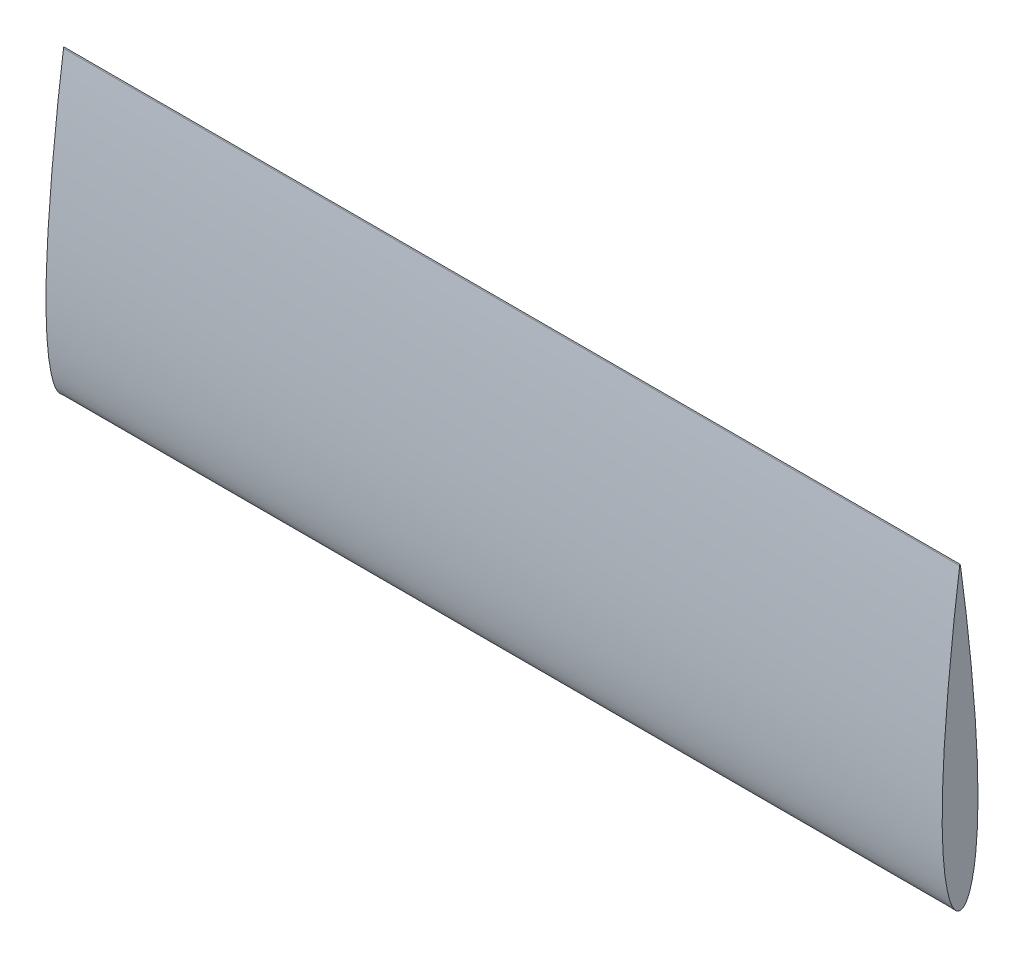
ISO-10303-21;
HEADER;
FILE_DESCRIPTION(('STEP AP214'),'2;1');
FILE_NAME('part.step','',(''),(''),'','','');
FILE_SCHEMA(('AUTOMOTIVE_DESIGN { 1 0 10303 214 1 1 1 1 }'));
ENDSEC;
DATA;
#1=APPLICATION_CONTEXT('core data for automotive mechanical design processes');
#2=APPLICATION_PROTOCOL_DEFINITION('international standard','automotive_design',2000,#1);
#3=PRODUCT_CONTEXT('',#1,'mechanical');
#4=PRODUCT('Part','Part','',(#3));
#5=PRODUCT_RELATED_PRODUCT_CATEGORY('part','',(#4));
#6=PRODUCT_DEFINITION_FORMATION('','',#4);
#7=PRODUCT_DEFINITION_CONTEXT('part definition',#1,'design');
#8=PRODUCT_DEFINITION('design','',#6,#7);
#9=PRODUCT_DEFINITION_SHAPE('','',#8);
#10=(LENGTH_UNIT() NAMED_UNIT(*) SI_UNIT(.MILLI.,.METRE.));
#11=(NAMED_UNIT(*) PLANE_ANGLE_UNIT() SI_UNIT($,.RADIAN.));
#12=(NAMED_UNIT(*) SI_UNIT($,.STERADIAN.) SOLID_ANGLE_UNIT());
#13=UNCERTAINTY_MEASURE_WITH_UNIT(LENGTH_MEASURE(1.E-05),#10,'distance_accuracy_value','');
#14=(GEOMETRIC_REPRESENTATION_CONTEXT(3) GLOBAL_UNCERTAINTY_ASSIGNED_CONTEXT((#13)) GLOBAL_UNIT_ASSIGNED_CONTEXT((#10,
#11,#12)) REPRESENTATION_CONTEXT('',''));
#15=CARTESIAN_POINT('',(0.,0.,0.));
#16=DIRECTION('',(0.,0.,1.));
#17=DIRECTION('',(1.,0.,0.));
#18=AXIS2_PLACEMENT_3D('',#15,#16,#17);
#19=CARTESIAN_POINT('',(300.,199.967881444763,-0.25650578558449));
#20=CARTESIAN_POINT('',(300.,201.774256733193,0.225257482093221));
#21=CARTESIAN_POINT('',(300.,200.,0.252));
#22=B_SPLINE_CURVE_WITH_KNOTS('',2,(#19,#20,#21),.UNSPECIFIED.,.F.,.F.,(3,3),(0.,1.),.UNSPECIFIED.);
#23=DIRECTION('',(-1.,0.,0.));
#24=VECTOR('',#23,1.);
#25=SURFACE_OF_LINEAR_EXTRUSION('',#22,#24);
#26=CARTESIAN_POINT('',(-300.,199.967881444763,-0.25650578558449));
#27=CARTESIAN_POINT('',(-300.,201.774256733193,0.225257482093221));
#28=CARTESIAN_POINT('',(-300.,200.,0.252));
#29=B_SPLINE_CURVE_WITH_KNOTS('',2,(#26,#27,#28),.UNSPECIFIED.,.F.,.F.,(3,3),(0.,1.),.UNSPECIFIED.);
#30=CARTESIAN_POINT('',(-300.,199.967881444761,-0.256505785584748));
#31=VERTEX_POINT('',#30);
#32=CARTESIAN_POINT('',(-300.,200.,0.252));
#33=VERTEX_POINT('',#32);
#34=EDGE_CURVE('E73',#31,#33,#29,.T.);
#35=ORIENTED_EDGE('',*,*,#34,.T.);
#36=DIRECTION('',(-1.,0.,0.));
#37=VECTOR('',#36,1.);
#38=CARTESIAN_POINT('',(300.,200.,0.252));
#39=LINE('',#38,#37);
#40=CARTESIAN_POINT('',(300.,200.,0.252));
#41=VERTEX_POINT('',#40);
#42=EDGE_CURVE('E11',#41,#33,#39,.T.);
#43=ORIENTED_EDGE('',*,*,#42,.F.);
#44=CARTESIAN_POINT('',(300.,199.967881444761,-0.256505785584748));
#45=VERTEX_POINT('',#44);
#46=EDGE_CURVE('E72',#45,#41,#22,.T.);
#47=ORIENTED_EDGE('',*,*,#46,.F.);
#48=DIRECTION('',(-1.,0.,0.));
#49=VECTOR('',#48,1.);
#50=CARTESIAN_POINT('',(300.,199.967881444761,-0.256505785584748));
#51=LINE('',#50,#49);
#52=EDGE_CURVE('E49',#45,#31,#51,.T.);
#53=ORIENTED_EDGE('',*,*,#52,.T.);
#54=EDGE_LOOP('',(#35,#43,#47,#53));
#55=FACE_BOUND('',#54,.T.);
#56=ADVANCED_FACE('F39',(#55),#25,.F.);
#57=CARTESIAN_POINT('',(300.,200.,0.252));
#58=CARTESIAN_POINT('',(300.,199.961073462549,0.257460921680953));
#59=CARTESIAN_POINT('',(300.,199.805464344266,0.279290996057645));
#60=CARTESIAN_POINT('',(300.,199.455684465291,0.328259605959474));
#61=CARTESIAN_POINT('',(300.,198.873630390625,0.409571381439755));
#62=CARTESIAN_POINT('',(300.,198.060656684456,0.522607426542408));
#63=CARTESIAN_POINT('',(300.,197.01866306736,0.666674539094853));
#64=CARTESIAN_POINT('',(300.,195.750085834567,0.840827461802448));
#65=CARTESIAN_POINT('',(300.,194.257880939373,1.04398693476492));
#66=CARTESIAN_POINT('',(300.,192.545535290461,1.27484720368877));
#67=CARTESIAN_POINT('',(300.,190.61704905316,1.53204746540601));
#68=CARTESIAN_POINT('',(300.,188.476922374053,1.81396953992731));
#69=CARTESIAN_POINT('',(300.,186.130159115465,2.11909904573172));
#70=CARTESIAN_POINT('',(300.,183.582224802527,2.44556113638906));
#71=CARTESIAN_POINT('',(300.,180.839083113847,2.79168172565745));
#72=CARTESIAN_POINT('',(300.,177.90713489902,3.15552337625383));
#73=CARTESIAN_POINT('',(300.,174.793235845287,3.53525218983446));
#74=CARTESIAN_POINT('',(300.,171.504645491081,3.92887756349891));
#75=CARTESIAN_POINT('',(300.,168.049053797605,4.33446003560873));
#76=CARTESIAN_POINT('',(300.,164.434531838681,4.75000692044848));
#77=CARTESIAN_POINT('',(300.,160.669528566926,5.1735858108412));
#78=CARTESIAN_POINT('',(300.,156.762822362585,5.60304436219836));
#79=CARTESIAN_POINT('',(300.,152.723540745018,6.03645832345471));
#80=CARTESIAN_POINT('',(300.,148.561125948286,6.47171923483878));
#81=CARTESIAN_POINT('',(300.,144.28528894305,6.90668685811932));
#82=CARTESIAN_POINT('',(300.,139.906034430789,7.33924636280671));
#83=CARTESIAN_POINT('',(300.,135.433569915737,7.76715096920159));
#84=CARTESIAN_POINT('',(300.,130.87835580778,8.18822315989405));
#85=CARTESIAN_POINT('',(300.,126.251019670898,8.60009997450111));
#86=CARTESIAN_POINT('',(300.,121.562382137434,9.00041300473399));
#87=CARTESIAN_POINT('',(300.,116.82337623243,9.38673601910347));
#88=CARTESIAN_POINT('',(300.,112.045077582558,9.75654540491965));
#89=CARTESIAN_POINT('',(300.,107.238642718273,10.1073665851091));
#90=CARTESIAN_POINT('',(300.,102.41529865337,10.4365698856851));
#91=CARTESIAN_POINT('',(300.,97.5863044345595,10.7415705842048));
#92=CARTESIAN_POINT('',(300.,92.7629375322089,11.0197752255089));
#93=CARTESIAN_POINT('',(300.,87.9564610192973,11.2685992236009));
#94=CARTESIAN_POINT('',(300.,83.1780927360442,11.485535840479));
#95=CARTESIAN_POINT('',(300.,78.4389885199032,11.6681228013325));
#96=CARTESIAN_POINT('',(300.,73.7502179623397,11.8140110543217));
#97=CARTESIAN_POINT('',(300.,69.122732446521,11.9210697806734));
#98=CARTESIAN_POINT('',(300.,64.56732733007,11.9872639086109));
#99=CARTESIAN_POINT('',(300.,60.0946393384857,12.0107998429971));
#100=CARTESIAN_POINT('',(300.,55.715111858067,11.9901384631717));
#101=CARTESIAN_POINT('',(300.,51.438973700615,11.924044272335));
#102=CARTESIAN_POINT('',(300.,47.2762014563288,11.8114941108719));
#103=CARTESIAN_POINT('',(300.,43.2365098395361,11.6518729595225));
#104=CARTESIAN_POINT('',(300.,39.3293305367621,11.4448824195998));
#105=CARTESIAN_POINT('',(300.,35.563786306922,11.1904762438273));
#106=CARTESIAN_POINT('',(300.,31.9486493938713,10.8890815711004));
#107=CARTESIAN_POINT('',(300.,28.4923434716612,10.5413955710374));
#108=CARTESIAN_POINT('',(300.,25.2029279406108,10.1483856764614));
#109=CARTESIAN_POINT('',(300.,22.0880474804513,9.71145571984603));
#110=CARTESIAN_POINT('',(300.,19.1549471204692,9.23208075318621));
#111=CARTESIAN_POINT('',(300.,16.4103963388728,8.71222812186602));
#112=CARTESIAN_POINT('',(300.,13.8607397636473,8.15378925483745));
#113=CARTESIAN_POINT('',(300.,11.5117794611663,7.55905821858464));
#114=CARTESIAN_POINT('',(300.,9.36884743424348,6.93019405439805));
#115=CARTESIAN_POINT('',(300.,7.43665990001652,6.26956601469714));
#116=CARTESIAN_POINT('',(300.,5.71934085794232,5.57938733984499));
#117=CARTESIAN_POINT('',(300.,4.22029726535338,4.86171235858859));
#118=CARTESIAN_POINT('',(300.,2.94218695582956,4.1181678871452));
#119=CARTESIAN_POINT('',(300.,1.886880457348,3.34959873201076));
#120=CARTESIAN_POINT('',(300.,1.05591435132427,2.55527055797925));
#121=CARTESIAN_POINT('',(300.,0.451977280813522,1.73239335837833));
#122=CARTESIAN_POINT('',(300.,0.0824005390450488,0.877395637301859));
#123=CARTESIAN_POINT('',(300.,-0.0401679816202648,0.));
#124=CARTESIAN_POINT('',(300.,0.0824005390450501,-0.877395637301861));
#125=CARTESIAN_POINT('',(300.,0.451977280813513,-1.73239335837832));
#126=CARTESIAN_POINT('',(300.,1.05591435132429,-2.55527055797928));
#127=CARTESIAN_POINT('',(300.,1.88688045734799,-3.34959873201075));
#128=CARTESIAN_POINT('',(300.,2.94218695582957,-4.11816788714522));
#129=CARTESIAN_POINT('',(300.,4.22029726535336,-4.86171235858858));
#130=CARTESIAN_POINT('',(300.,5.71934085794231,-5.57938733984499));
#131=CARTESIAN_POINT('',(300.,7.43665990001654,-6.26956601469715));
#132=CARTESIAN_POINT('',(300.,9.36884743424346,-6.93019405439804));
#133=CARTESIAN_POINT('',(300.,11.5117794611663,-7.55905821858464));
#134=CARTESIAN_POINT('',(300.,13.8607397636473,-8.15378925483745));
#135=CARTESIAN_POINT('',(300.,16.4103963388728,-8.71222812186602));
#136=CARTESIAN_POINT('',(300.,19.1549471204692,-9.2320807531862));
#137=CARTESIAN_POINT('',(300.,22.0880474804514,-9.71145571984605));
#138=CARTESIAN_POINT('',(300.,25.2029279406108,-10.1483856764614));
#139=CARTESIAN_POINT('',(300.,28.4923434716612,-10.5413955710374));
#140=CARTESIAN_POINT('',(300.,31.9486493938713,-10.8890815711004));
#141=CARTESIAN_POINT('',(300.,35.563786306922,-11.1904762438273));
#142=CARTESIAN_POINT('',(300.,39.3293305367621,-11.4448824195998));
#143=CARTESIAN_POINT('',(300.,43.236509839536,-11.6518729595225));
#144=CARTESIAN_POINT('',(300.,47.2762014563288,-11.8114941108719));
#145=CARTESIAN_POINT('',(300.,51.438973700615,-11.924044272335));
#146=CARTESIAN_POINT('',(300.,55.7151118580669,-11.9901384631717));
#147=CARTESIAN_POINT('',(300.,60.0946393384858,-12.0107998429971));
#148=CARTESIAN_POINT('',(300.,64.5673273300699,-11.9872639086109));
#149=CARTESIAN_POINT('',(300.,69.122732446521,-11.9210697806734));
#150=CARTESIAN_POINT('',(300.,73.7502179623397,-11.8140110543217));
#151=CARTESIAN_POINT('',(300.,78.4389885199032,-11.6681228013325));
#152=CARTESIAN_POINT('',(300.,83.1780927360442,-11.485535840479));
#153=CARTESIAN_POINT('',(300.,87.9564610192974,-11.2685992236009));
#154=CARTESIAN_POINT('',(300.,92.7629375322088,-11.0197752255089));
#155=CARTESIAN_POINT('',(300.,97.5863044345596,-10.7415705842048));
#156=CARTESIAN_POINT('',(300.,102.41529865337,-10.4365698856851));
#157=CARTESIAN_POINT('',(300.,107.238642718273,-10.1073665851091));
#158=CARTESIAN_POINT('',(300.,112.045077582558,-9.75654540491965));
#159=CARTESIAN_POINT('',(300.,116.82337623243,-9.38673601910347));
#160=CARTESIAN_POINT('',(300.,121.562382137434,-9.00041300473399));
#161=CARTESIAN_POINT('',(300.,126.251019670898,-8.60009997450111));
#162=CARTESIAN_POINT('',(300.,130.87835580778,-8.18822315989405));
#163=CARTESIAN_POINT('',(300.,135.433569915737,-7.76715096920159));
#164=CARTESIAN_POINT('',(300.,139.906034430789,-7.33924636280671));
#165=CARTESIAN_POINT('',(300.,144.28528894305,-6.90668685811931));
#166=CARTESIAN_POINT('',(300.,148.561125948286,-6.47171923483878));
#167=CARTESIAN_POINT('',(300.,152.723540745018,-6.03645832345471));
#168=CARTESIAN_POINT('',(300.,156.762822362585,-5.60304436219836));
#169=CARTESIAN_POINT('',(300.,160.669528566926,-5.17358581084119));
#170=CARTESIAN_POINT('',(300.,164.434531838681,-4.75000692044849));
#171=CARTESIAN_POINT('',(300.,168.049053797605,-4.33446003560872));
#172=CARTESIAN_POINT('',(300.,171.504645491081,-3.92887756349892));
#173=CARTESIAN_POINT('',(300.,174.793235845287,-3.53525218983446));
#174=CARTESIAN_POINT('',(300.,177.90713489902,-3.15552337625383));
#175=CARTESIAN_POINT('',(300.,180.839083113847,-2.79168172565745));
#176=CARTESIAN_POINT('',(300.,183.582224802527,-2.44556113638906));
#177=CARTESIAN_POINT('',(300.,186.130159115465,-2.11909904573172));
#178=CARTESIAN_POINT('',(300.,188.476922374053,-1.81396953992731));
#179=CARTESIAN_POINT('',(300.,190.61704905316,-1.532047465406));
#180=CARTESIAN_POINT('',(300.,192.545535290461,-1.27484720368877));
#181=CARTESIAN_POINT('',(300.,194.257880939373,-1.04398693476492));
#182=CARTESIAN_POINT('',(300.,195.750085834567,-0.840827461802445));
#183=CARTESIAN_POINT('',(300.,197.01866306736,-0.666674539094855));
#184=CARTESIAN_POINT('',(300.,198.060656684456,-0.522607426542407));
#185=CARTESIAN_POINT('',(300.,198.873630390625,-0.409571381439756));
#186=CARTESIAN_POINT('',(300.,199.455684465291,-0.328259605959472));
#187=CARTESIAN_POINT('',(300.,199.805464344266,-0.279290996057652));
#188=CARTESIAN_POINT('',(300.,199.961073462549,-0.257460921680953));
#189=CARTESIAN_POINT('',(300.,200.,-0.252));
#190=B_SPLINE_CURVE_WITH_KNOTS('',3,(#57,#58,#59,#60,#61,#62,#63,#64,#65,#66,#67,#68,#69,#70,
#71,#72,#73,#74,#75,#76,#77,#78,#79,#80,#81,#82,#83,#84,#85,#86,#87,#88,#89,#90,#91,#92,#93,#94,
#95,#96,#97,#98,#99,#100,#101,#102,#103,#104,#105,#106,#107,#108,#109,#110,#111,#112,#113,#114,
#115,#116,#117,#118,#119,#120,#121,#122,#123,#124,#125,#126,#127,#128,#129,#130,#131,#132,#133,
#134,#135,#136,#137,#138,#139,#140,#141,#142,#143,#144,#145,#146,#147,#148,#149,#150,#151,#152,
#153,#154,#155,#156,#157,#158,#159,#160,#161,#162,#163,#164,#165,#166,#167,#168,#169,#170,#171,
#172,#173,#174,#175,#176,#177,#178,#179,#180,#181,#182,#183,#184,#185,#186,#187,#188,#189),
.UNSPECIFIED.,.F.,.F.,(4,1,1,1,1,1,1,1,1,1,1,1,1,1,1,1,1,1,1,1,1,1,1,1,1,1,1,1,1,1,1,1,1,1,1,1,
1,1,1,1,1,1,1,1,1,1,1,1,1,1,1,1,1,1,1,1,1,1,1,1,1,1,1,1,1,1,1,1,1,1,1,1,1,1,1,1,1,1,1,1,1,1,1,1,
1,1,1,1,1,1,1,1,1,1,1,1,1,1,1,1,1,1,1,1,1,1,1,1,1,1,1,1,1,1,1,1,1,1,1,1,1,1,1,1,1,1,1,1,1,1,4),
(0.,0.000289146012208075,0.00115586329945761,0.00259805874790931,0.00461228876571106,
0.0071935929733987,0.0103358351467946,0.0140314129150333,0.0182714534854211,0.0230457375913408,
0.0283428821695204,0.0341501370920948,0.0404537305224403,0.0472385925337366,0.0544885550062153,
0.0621864377849774,0.0703139762203532,0.0788519427142012,0.0877800920894453,0.097077362143576,
0.106721846803723,0.116690748252035,0.126960675542605,0.137507310724012,0.14830591335894,
0.159331010090231,0.170556758010199,0.181956676151837,0.193504010213206,0.205171586378334,
0.216932159347369,0.228757986521069,0.240621460081088,0.252494885661238,0.26435049076449,
0.276160731135953,0.287898257272151,0.299535924833915,0.311046958730048,0.322405016007326,
0.33358424112908,0.34455942720365,0.355305876694046,0.365799652157998,0.376017632735469,
0.385937515259466,0.395537820767709,0.404798053904225,0.413698796542159,0.422221689314506,
0.430349461124564,0.4380661515799,0.445357166330782,0.452209423283855,0.458611485415412,
0.464554009305641,0.470029937535629,0.475035084210348,0.479569178588025,0.483636915774579,
0.487250221980046,0.490431492848229,0.493218846943701,0.495674070493982,0.497891229124201,0.5,
0.502108770875798,0.504325929506018,0.506781153056298,0.509568507151771,0.512749778019954,
0.516363084225421,0.520430821411975,0.524964915789652,0.52997006246437,0.535445990694358,
0.541388514584587,0.547790576716145,0.554642833669218,0.5619338484201,0.569650538875436,
0.577778310685494,0.586301203457841,0.595201946095775,0.604462179232291,0.614062484740533,
0.623982367264531,0.634200347842002,0.644694123305954,0.65544057279635,0.66641575887092,
0.677594983992674,0.688953041269952,0.700464075166085,0.712101742727849,0.723839268864047,
0.73564950923551,0.747505114338762,0.759378539918911,0.77124201347893,0.783067840652631,
0.794828413621666,0.806495989786793,0.818043323848163,0.829443241989801,0.840668989909769,
0.85169408664106,0.862492689275988,0.873039324457395,0.883309251747965,0.893278153196277,
0.902922637856424,0.912219907910555,0.921148057285799,0.929686023779647,0.937813562215023,
0.945511444993785,0.952761407466263,0.95954626947756,0.965849862907905,0.971657117830479,
0.976954262408659,0.981728546514579,0.985968587084967,0.989664164853205,0.992806407026601,
0.995387711234289,0.997401941252091,0.998844136700542,0.999710853987792,1.),.UNSPECIFIED.);
#191=DIRECTION('',(-1.,0.,0.));
#192=VECTOR('',#191,1.);
#193=SURFACE_OF_LINEAR_EXTRUSION('',#190,#192);
#194=CARTESIAN_POINT('',(-300.,200.,0.252));
#195=CARTESIAN_POINT('',(-300.,199.961073462549,0.257460921680953));
#196=CARTESIAN_POINT('',(-300.,199.805464344266,0.279290996057645));
#197=CARTESIAN_POINT('',(-300.,199.455684465291,0.328259605959474));
#198=CARTESIAN_POINT('',(-300.,198.873630390625,0.409571381439755));
#199=CARTESIAN_POINT('',(-300.,198.060656684456,0.522607426542408));
#200=CARTESIAN_POINT('',(-300.,197.01866306736,0.666674539094853));
#201=CARTESIAN_POINT('',(-300.,195.750085834567,0.840827461802448));
#202=CARTESIAN_POINT('',(-300.,194.257880939373,1.04398693476492));
#203=CARTESIAN_POINT('',(-300.,192.545535290461,1.27484720368877));
#204=CARTESIAN_POINT('',(-300.,190.61704905316,1.53204746540601));
#205=CARTESIAN_POINT('',(-300.,188.476922374053,1.81396953992731));
#206=CARTESIAN_POINT('',(-300.,186.130159115465,2.11909904573172));
#207=CARTESIAN_POINT('',(-300.,183.582224802527,2.44556113638906));
#208=CARTESIAN_POINT('',(-300.,180.839083113847,2.79168172565745));
#209=CARTESIAN_POINT('',(-300.,177.90713489902,3.15552337625383));
#210=CARTESIAN_POINT('',(-300.,174.793235845287,3.53525218983446));
#211=CARTESIAN_POINT('',(-300.,171.504645491081,3.92887756349891));
#212=CARTESIAN_POINT('',(-300.,168.049053797605,4.33446003560873));
#213=CARTESIAN_POINT('',(-300.,164.434531838681,4.75000692044848));
#214=CARTESIAN_POINT('',(-300.,160.669528566926,5.1735858108412));
#215=CARTESIAN_POINT('',(-300.,156.762822362585,5.60304436219836));
#216=CARTESIAN_POINT('',(-300.,152.723540745018,6.03645832345471));
#217=CARTESIAN_POINT('',(-300.,148.561125948286,6.47171923483878));
#218=CARTESIAN_POINT('',(-300.,144.28528894305,6.90668685811932));
#219=CARTESIAN_POINT('',(-300.,139.906034430789,7.33924636280671));
#220=CARTESIAN_POINT('',(-300.,135.433569915737,7.76715096920159));
#221=CARTESIAN_POINT('',(-300.,130.87835580778,8.18822315989405));
#222=CARTESIAN_POINT('',(-300.,126.251019670898,8.60009997450111));
#223=CARTESIAN_POINT('',(-300.,121.562382137434,9.00041300473399));
#224=CARTESIAN_POINT('',(-300.,116.82337623243,9.38673601910347));
#225=CARTESIAN_POINT('',(-300.,112.045077582558,9.75654540491965));
#226=CARTESIAN_POINT('',(-300.,107.238642718273,10.1073665851091));
#227=CARTESIAN_POINT('',(-300.,102.41529865337,10.4365698856851));
#228=CARTESIAN_POINT('',(-300.,97.5863044345595,10.7415705842048));
#229=CARTESIAN_POINT('',(-300.,92.7629375322089,11.0197752255089));
#230=CARTESIAN_POINT('',(-300.,87.9564610192973,11.2685992236009));
#231=CARTESIAN_POINT('',(-300.,83.1780927360442,11.485535840479));
#232=CARTESIAN_POINT('',(-300.,78.4389885199032,11.6681228013325));
#233=CARTESIAN_POINT('',(-300.,73.7502179623397,11.8140110543217));
#234=CARTESIAN_POINT('',(-300.,69.122732446521,11.9210697806734));
#235=CARTESIAN_POINT('',(-300.,64.56732733007,11.9872639086109));
#236=CARTESIAN_POINT('',(-300.,60.0946393384857,12.0107998429971));
#237=CARTESIAN_POINT('',(-300.,55.715111858067,11.9901384631717));
#238=CARTESIAN_POINT('',(-300.,51.438973700615,11.924044272335));
#239=CARTESIAN_POINT('',(-300.,47.2762014563288,11.8114941108719));
#240=CARTESIAN_POINT('',(-300.,43.2365098395361,11.6518729595225));
#241=CARTESIAN_POINT('',(-300.,39.3293305367621,11.4448824195998));
#242=CARTESIAN_POINT('',(-300.,35.563786306922,11.1904762438273));
#243=CARTESIAN_POINT('',(-300.,31.9486493938713,10.8890815711004));
#244=CARTESIAN_POINT('',(-300.,28.4923434716612,10.5413955710374));
#245=CARTESIAN_POINT('',(-300.,25.2029279406108,10.1483856764614));
#246=CARTESIAN_POINT('',(-300.,22.0880474804513,9.71145571984603));
#247=CARTESIAN_POINT('',(-300.,19.1549471204692,9.23208075318621));
#248=CARTESIAN_POINT('',(-300.,16.4103963388728,8.71222812186602));
#249=CARTESIAN_POINT('',(-300.,13.8607397636473,8.15378925483745));
#250=CARTESIAN_POINT('',(-300.,11.5117794611663,7.55905821858464));
#251=CARTESIAN_POINT('',(-300.,9.36884743424348,6.93019405439805));
#252=CARTESIAN_POINT('',(-300.,7.43665990001652,6.26956601469714));
#253=CARTESIAN_POINT('',(-300.,5.71934085794232,5.57938733984499));
#254=CARTESIAN_POINT('',(-300.,4.22029726535338,4.86171235858859));
#255=CARTESIAN_POINT('',(-300.,2.94218695582956,4.1181678871452));
#256=CARTESIAN_POINT('',(-300.,1.886880457348,3.34959873201076));
#257=CARTESIAN_POINT('',(-300.,1.05591435132427,2.55527055797925));
#258=CARTESIAN_POINT('',(-300.,0.451977280813522,1.73239335837833));
#259=CARTESIAN_POINT('',(-300.,0.0824005390450488,0.877395637301859));
#260=CARTESIAN_POINT('',(-300.,-0.0401679816202648,0.));
#261=CARTESIAN_POINT('',(-300.,0.0824005390450501,-0.877395637301861));
#262=CARTESIAN_POINT('',(-300.,0.451977280813513,-1.73239335837832));
#263=CARTESIAN_POINT('',(-300.,1.05591435132429,-2.55527055797928));
#264=CARTESIAN_POINT('',(-300.,1.88688045734799,-3.34959873201075));
#265=CARTESIAN_POINT('',(-300.,2.94218695582957,-4.11816788714522));
#266=CARTESIAN_POINT('',(-300.,4.22029726535336,-4.86171235858858));
#267=CARTESIAN_POINT('',(-300.,5.71934085794231,-5.57938733984499));
#268=CARTESIAN_POINT('',(-300.,7.43665990001654,-6.26956601469715));
#269=CARTESIAN_POINT('',(-300.,9.36884743424346,-6.93019405439804));
#270=CARTESIAN_POINT('',(-300.,11.5117794611663,-7.55905821858464));
#271=CARTESIAN_POINT('',(-300.,13.8607397636473,-8.15378925483745));
#272=CARTESIAN_POINT('',(-300.,16.4103963388728,-8.71222812186602));
#273=CARTESIAN_POINT('',(-300.,19.1549471204692,-9.2320807531862));
#274=CARTESIAN_POINT('',(-300.,22.0880474804514,-9.71145571984605));
#275=CARTESIAN_POINT('',(-300.,25.2029279406108,-10.1483856764614));
#276=CARTESIAN_POINT('',(-300.,28.4923434716612,-10.5413955710374));
#277=CARTESIAN_POINT('',(-300.,31.9486493938713,-10.8890815711004));
#278=CARTESIAN_POINT('',(-300.,35.563786306922,-11.1904762438273));
#279=CARTESIAN_POINT('',(-300.,39.3293305367621,-11.4448824195998));
#280=CARTESIAN_POINT('',(-300.,43.236509839536,-11.6518729595225));
#281=CARTESIAN_POINT('',(-300.,47.2762014563288,-11.8114941108719));
#282=CARTESIAN_POINT('',(-300.,51.438973700615,-11.924044272335));
#283=CARTESIAN_POINT('',(-300.,55.7151118580669,-11.9901384631717));
#284=CARTESIAN_POINT('',(-300.,60.0946393384858,-12.0107998429971));
#285=CARTESIAN_POINT('',(-300.,64.5673273300699,-11.9872639086109));
#286=CARTESIAN_POINT('',(-300.,69.122732446521,-11.9210697806734));
#287=CARTESIAN_POINT('',(-300.,73.7502179623397,-11.8140110543217));
#288=CARTESIAN_POINT('',(-300.,78.4389885199032,-11.6681228013325));
#289=CARTESIAN_POINT('',(-300.,83.1780927360442,-11.485535840479));
#290=CARTESIAN_POINT('',(-300.,87.9564610192974,-11.2685992236009));
#291=CARTESIAN_POINT('',(-300.,92.7629375322088,-11.0197752255089));
#292=CARTESIAN_POINT('',(-300.,97.5863044345596,-10.7415705842048));
#293=CARTESIAN_POINT('',(-300.,102.41529865337,-10.4365698856851));
#294=CARTESIAN_POINT('',(-300.,107.238642718273,-10.1073665851091));
#295=CARTESIAN_POINT('',(-300.,112.045077582558,-9.75654540491965));
#296=CARTESIAN_POINT('',(-300.,116.82337623243,-9.38673601910347));
#297=CARTESIAN_POINT('',(-300.,121.562382137434,-9.00041300473399));
#298=CARTESIAN_POINT('',(-300.,126.251019670898,-8.60009997450111));
#299=CARTESIAN_POINT('',(-300.,130.87835580778,-8.18822315989405));
#300=CARTESIAN_POINT('',(-300.,135.433569915737,-7.76715096920159));
#301=CARTESIAN_POINT('',(-300.,139.906034430789,-7.33924636280671));
#302=CARTESIAN_POINT('',(-300.,144.28528894305,-6.90668685811931));
#303=CARTESIAN_POINT('',(-300.,148.561125948286,-6.47171923483878));
#304=CARTESIAN_POINT('',(-300.,152.723540745018,-6.03645832345471));
#305=CARTESIAN_POINT('',(-300.,156.762822362585,-5.60304436219836));
#306=CARTESIAN_POINT('',(-300.,160.669528566926,-5.17358581084119));
#307=CARTESIAN_POINT('',(-300.,164.434531838681,-4.75000692044849));
#308=CARTESIAN_POINT('',(-300.,168.049053797605,-4.33446003560872));
#309=CARTESIAN_POINT('',(-300.,171.504645491081,-3.92887756349892));
#310=CARTESIAN_POINT('',(-300.,174.793235845287,-3.53525218983446));
#311=CARTESIAN_POINT('',(-300.,177.90713489902,-3.15552337625383));
#312=CARTESIAN_POINT('',(-300.,180.839083113847,-2.79168172565745));
#313=CARTESIAN_POINT('',(-300.,183.582224802527,-2.44556113638906));
#314=CARTESIAN_POINT('',(-300.,186.130159115465,-2.11909904573172));
#315=CARTESIAN_POINT('',(-300.,188.476922374053,-1.81396953992731));
#316=CARTESIAN_POINT('',(-300.,190.61704905316,-1.532047465406));
#317=CARTESIAN_POINT('',(-300.,192.545535290461,-1.27484720368877));
#318=CARTESIAN_POINT('',(-300.,194.257880939373,-1.04398693476492));
#319=CARTESIAN_POINT('',(-300.,195.750085834567,-0.840827461802445));
#320=CARTESIAN_POINT('',(-300.,197.01866306736,-0.666674539094855));
#321=CARTESIAN_POINT('',(-300.,198.060656684456,-0.522607426542407));
#322=CARTESIAN_POINT('',(-300.,198.873630390625,-0.409571381439756));
#323=CARTESIAN_POINT('',(-300.,199.455684465291,-0.328259605959472));
#324=CARTESIAN_POINT('',(-300.,199.805464344266,-0.279290996057652));
#325=CARTESIAN_POINT('',(-300.,199.961073462549,-0.257460921680953));
#326=CARTESIAN_POINT('',(-300.,200.,-0.252));
#327=B_SPLINE_CURVE_WITH_KNOTS('',3,(#194,#195,#196,#197,#198,#199,#200,#201,#202,#203,#204,
#205,#206,#207,#208,#209,#210,#211,#212,#213,#214,#215,#216,#217,#218,#219,#220,#221,#222,#223,
#224,#225,#226,#227,#228,#229,#230,#231,#232,#233,#234,#235,#236,#237,#238,#239,#240,#241,#242,
#243,#244,#245,#246,#247,#248,#249,#250,#251,#252,#253,#254,#255,#256,#257,#258,#259,#260,#261,
#262,#263,#264,#265,#266,#267,#268,#269,#270,#271,#272,#273,#274,#275,#276,#277,#278,#279,#280,
#281,#282,#283,#284,#285,#286,#287,#288,#289,#290,#291,#292,#293,#294,#295,#296,#297,#298,#299,
#300,#301,#302,#303,#304,#305,#306,#307,#308,#309,#310,#311,#312,#313,#314,#315,#316,#317,#318,
#319,#320,#321,#322,#323,#324,#325,#326),.UNSPECIFIED.,.F.,.F.,(4,1,1,1,1,1,1,1,1,1,1,1,1,1,1,1,
1,1,1,1,1,1,1,1,1,1,1,1,1,1,1,1,1,1,1,1,1,1,1,1,1,1,1,1,1,1,1,1,1,1,1,1,1,1,1,1,1,1,1,1,1,1,1,1,
1,1,1,1,1,1,1,1,1,1,1,1,1,1,1,1,1,1,1,1,1,1,1,1,1,1,1,1,1,1,1,1,1,1,1,1,1,1,1,1,1,1,1,1,1,1,1,1,
1,1,1,1,1,1,1,1,1,1,1,1,1,1,1,1,1,1,4),(0.,0.000289146012208075,0.00115586329945761,
0.00259805874790931,0.00461228876571106,0.0071935929733987,0.0103358351467946,
0.0140314129150333,0.0182714534854211,0.0230457375913408,0.0283428821695204,0.0341501370920948,
0.0404537305224403,0.0472385925337366,0.0544885550062153,0.0621864377849774,0.0703139762203532,
0.0788519427142012,0.0877800920894453,0.097077362143576,0.106721846803723,0.116690748252035,
0.126960675542605,0.137507310724012,0.14830591335894,0.159331010090231,0.170556758010199,
0.181956676151837,0.193504010213206,0.205171586378334,0.216932159347369,0.228757986521069,
0.240621460081088,0.252494885661238,0.26435049076449,0.276160731135953,0.287898257272151,
0.299535924833915,0.311046958730048,0.322405016007326,0.33358424112908,0.34455942720365,
0.355305876694046,0.365799652157998,0.376017632735469,0.385937515259466,0.395537820767709,
0.404798053904225,0.413698796542159,0.422221689314506,0.430349461124564,0.4380661515799,
0.445357166330782,0.452209423283855,0.458611485415412,0.464554009305641,0.470029937535629,
0.475035084210348,0.479569178588025,0.483636915774579,0.487250221980046,0.490431492848229,
0.493218846943701,0.495674070493982,0.497891229124201,0.5,0.502108770875798,0.504325929506018,
0.506781153056298,0.509568507151771,0.512749778019954,0.516363084225421,0.520430821411975,
0.524964915789652,0.52997006246437,0.535445990694358,0.541388514584587,0.547790576716145,
0.554642833669218,0.5619338484201,0.569650538875436,0.577778310685494,0.586301203457841,
0.595201946095775,0.604462179232291,0.614062484740533,0.623982367264531,0.634200347842002,
0.644694123305954,0.65544057279635,0.66641575887092,0.677594983992674,0.688953041269952,
0.700464075166085,0.712101742727849,0.723839268864047,0.73564950923551,0.747505114338762,
0.759378539918911,0.77124201347893,0.783067840652631,0.794828413621666,0.806495989786793,
0.818043323848163,0.829443241989801,0.840668989909769,0.85169408664106,0.862492689275988,
0.873039324457395,0.883309251747965,0.893278153196277,0.902922637856424,0.912219907910555,
0.921148057285799,0.929686023779647,0.937813562215023,0.945511444993785,0.952761407466263,
0.95954626947756,0.965849862907905,0.971657117830479,0.976954262408659,0.981728546514579,
0.985968587084967,0.989664164853205,0.992806407026601,0.995387711234289,0.997401941252091,
0.998844136700542,0.999710853987792,1.),.UNSPECIFIED.);
#328=EDGE_CURVE('E64',#33,#31,#327,.T.);
#329=ORIENTED_EDGE('',*,*,#328,.T.);
#330=ORIENTED_EDGE('',*,*,#52,.F.);
#331=EDGE_CURVE('E56',#41,#45,#190,.T.);
#332=ORIENTED_EDGE('',*,*,#331,.F.);
#333=ORIENTED_EDGE('',*,*,#42,.T.);
#334=EDGE_LOOP('',(#329,#330,#332,#333));
#335=FACE_BOUND('',#334,.T.);
#336=ADVANCED_FACE('F67',(#335),#193,.F.);
#337=CARTESIAN_POINT('',(300.,200.879098727787,0.111502294650488));
#338=DIRECTION('',(1.,0.,0.));
#339=DIRECTION('',(0.,0.,-1.));
#340=AXIS2_PLACEMENT_3D('',#337,#338,#339);
#341=PLANE('',#340);
#342=ORIENTED_EDGE('',*,*,#46,.T.);
#343=ORIENTED_EDGE('',*,*,#331,.T.);
#344=EDGE_LOOP('',(#342,#343));
#345=FACE_BOUND('',#344,.T.);
#346=ADVANCED_FACE('F103',(#345),#341,.T.);
#347=CARTESIAN_POINT('',(-300.,200.879098727787,0.111502294650488));
#348=DIRECTION('',(1.,0.,0.));
#349=DIRECTION('',(0.,0.,-1.));
#350=AXIS2_PLACEMENT_3D('',#347,#348,#349);
#351=PLANE('',#350);
#352=ORIENTED_EDGE('',*,*,#34,.F.);
#353=ORIENTED_EDGE('',*,*,#328,.F.);
#354=EDGE_LOOP('',(#352,#353));
#355=FACE_BOUND('',#354,.T.);
#356=ADVANCED_FACE('F77',(#355),#351,.F.);
#357=CLOSED_SHELL('',(#56,#336,#346,#356));
#358=MANIFOLD_SOLID_BREP('B2',#357);
#359=ADVANCED_BREP_SHAPE_REPRESENTATION('',(#18,#358),#14);
#360=SHAPE_DEFINITION_REPRESENTATION(#9,#359);
ENDSEC;
END-ISO-10303-21;
